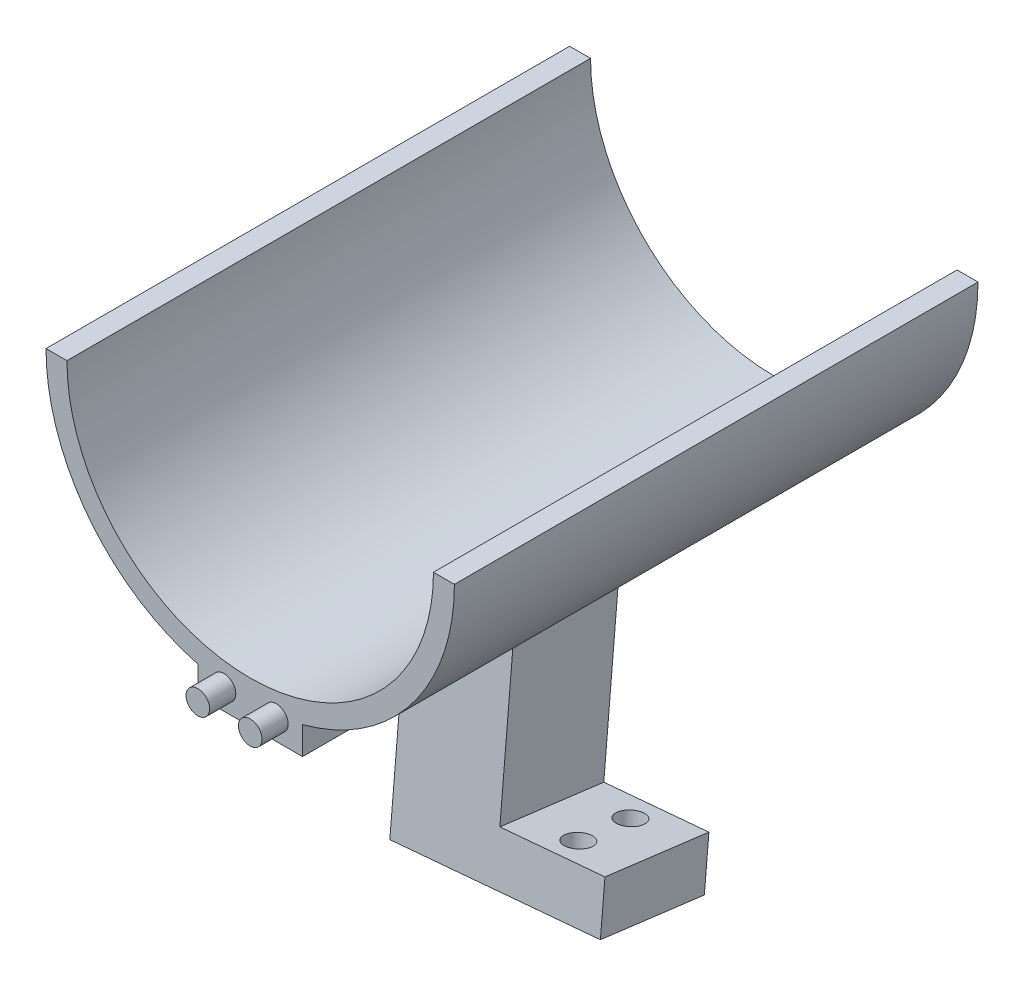
ISO-10303-21;
HEADER;
FILE_DESCRIPTION(('STEP AP214'),'2;1');
FILE_NAME('part.step','',(''),(''),'','','');
FILE_SCHEMA(('AUTOMOTIVE_DESIGN { 1 0 10303 214 1 1 1 1 }'));
ENDSEC;
DATA;
#1=APPLICATION_CONTEXT('core data for automotive mechanical design processes');
#2=APPLICATION_PROTOCOL_DEFINITION('international standard','automotive_design',2000,#1);
#3=PRODUCT_CONTEXT('',#1,'mechanical');
#4=PRODUCT('Part','Part','',(#3));
#5=PRODUCT_RELATED_PRODUCT_CATEGORY('part','',(#4));
#6=PRODUCT_DEFINITION_FORMATION('','',#4);
#7=PRODUCT_DEFINITION_CONTEXT('part definition',#1,'design');
#8=PRODUCT_DEFINITION('design','',#6,#7);
#9=PRODUCT_DEFINITION_SHAPE('','',#8);
#10=(LENGTH_UNIT() NAMED_UNIT(*) SI_UNIT(.MILLI.,.METRE.));
#11=(NAMED_UNIT(*) PLANE_ANGLE_UNIT() SI_UNIT($,.RADIAN.));
#12=(NAMED_UNIT(*) SI_UNIT($,.STERADIAN.) SOLID_ANGLE_UNIT());
#13=UNCERTAINTY_MEASURE_WITH_UNIT(LENGTH_MEASURE(1.E-05),#10,'distance_accuracy_value','');
#14=(GEOMETRIC_REPRESENTATION_CONTEXT(3) GLOBAL_UNCERTAINTY_ASSIGNED_CONTEXT((#13)) GLOBAL_UNIT_ASSIGNED_CONTEXT((#10,
#11,#12)) REPRESENTATION_CONTEXT('',''));
#15=CARTESIAN_POINT('',(0.,0.,0.));
#16=DIRECTION('',(0.,0.,1.));
#17=DIRECTION('',(1.,0.,0.));
#18=AXIS2_PLACEMENT_3D('',#15,#16,#17);
#19=CARTESIAN_POINT('',(9.99999999999999,3.11086419730137,35.544910429642));
#20=DIRECTION('',(-1.,0.,0.));
#21=DIRECTION('',(0.,0.,1.));
#22=AXIS2_PLACEMENT_3D('',#19,#20,#21);
#23=PLANE('',#22);
#24=DIRECTION('',(0.,0.126169711722162,0.992008671254413));
#25=VECTOR('',#24,1.);
#26=CARTESIAN_POINT('',(9.99999999999999,-75.9900166830293,42.4653407815849));
#27=LINE('',#26,#25);
#28=CARTESIAN_POINT('',(9.99999999999999,-75.9900166830294,42.4653407815849));
#29=VERTEX_POINT('',#28);
#30=CARTESIAN_POINT('',(10.,-73.4646784272924,62.3207990635066));
#31=VERTEX_POINT('',#30);
#32=EDGE_CURVE('E59',#29,#31,#27,.T.);
#33=ORIENTED_EDGE('',*,*,#32,.F.);
#34=DIRECTION('',(0.,-0.996194698091746,0.0871557427476515));
#35=VECTOR('',#34,1.);
#36=CARTESIAN_POINT('',(9.99999999999999,3.11086419730137,35.544910429642));
#37=LINE('',#36,#35);
#38=CARTESIAN_POINT('',(9.99999999999999,-37.6961536499415,39.1150618835755));
#39=VERTEX_POINT('',#38);
#40=EDGE_CURVE('E214',#39,#29,#37,.T.);
#41=ORIENTED_EDGE('',*,*,#40,.F.);
#42=DIRECTION('',(0.,0.,-1.));
#43=VECTOR('',#42,1.);
#44=CARTESIAN_POINT('',(10.,-37.6961536499415,100.));
#45=LINE('',#44,#43);
#46=CARTESIAN_POINT('',(10.,-37.6961536499415,59.1914586344425));
#47=VERTEX_POINT('',#46);
#48=EDGE_CURVE('E216',#47,#39,#45,.T.);
#49=ORIENTED_EDGE('',*,*,#48,.F.);
#50=DIRECTION('',(0.,-0.996194698091746,0.0871557427476515));
#51=VECTOR('',#50,1.);
#52=CARTESIAN_POINT('',(10.,4.8539790522544,55.4688043914769));
#53=LINE('',#52,#51);
#54=EDGE_CURVE('E64',#47,#31,#53,.T.);
#55=ORIENTED_EDGE('',*,*,#54,.T.);
#56=EDGE_LOOP('',(#33,#41,#49,#55));
#57=FACE_BOUND('',#56,.T.);
#58=ADVANCED_FACE('F44',(#57),#23,.F.);
#59=CARTESIAN_POINT('',(0.,0.,100.));
#60=DIRECTION('',(0.,0.,-1.));
#61=DIRECTION('',(-1.,0.,0.));
#62=AXIS2_PLACEMENT_3D('',#59,#60,#61);
#63=CYLINDRICAL_SURFACE('',#62,39.);
#64=DIRECTION('',(0.,0.,-1.));
#65=VECTOR('',#64,1.);
#66=CARTESIAN_POINT('',(10.,-37.6961536499415,100.));
#67=LINE('',#66,#65);
#68=CARTESIAN_POINT('',(10.,-37.6961536499415,0.));
#69=VERTEX_POINT('',#68);
#70=CARTESIAN_POINT('',(10.,-37.6961536499415,9.99999999999999));
#71=VERTEX_POINT('',#70);
#72=EDGE_CURVE('E261',#69,#71,#67,.F.);
#73=ORIENTED_EDGE('',*,*,#72,.F.);
#74=CARTESIAN_POINT('',(0.,0.,0.));
#75=DIRECTION('',(0.,0.,1.));
#76=DIRECTION('',(1.,0.,0.));
#77=AXIS2_PLACEMENT_3D('',#74,#75,#76);
#78=CIRCLE('',#77,39.);
#79=CARTESIAN_POINT('',(39.,0.,0.));
#80=VERTEX_POINT('',#79);
#81=EDGE_CURVE('E306',#69,#80,#78,.T.);
#82=ORIENTED_EDGE('',*,*,#81,.T.);
#83=DIRECTION('',(0.,0.,-1.));
#84=VECTOR('',#83,1.);
#85=CARTESIAN_POINT('',(39.,0.,100.));
#86=LINE('',#85,#84);
#87=CARTESIAN_POINT('',(39.,0.,100.));
#88=VERTEX_POINT('',#87);
#89=EDGE_CURVE('E11',#88,#80,#86,.T.);
#90=ORIENTED_EDGE('',*,*,#89,.F.);
#91=CARTESIAN_POINT('',(0.,0.,100.));
#92=DIRECTION('',(0.,0.,1.));
#93=DIRECTION('',(1.,0.,0.));
#94=AXIS2_PLACEMENT_3D('',#91,#92,#93);
#95=CIRCLE('',#94,39.);
#96=CARTESIAN_POINT('',(10.,-37.6961536499415,100.));
#97=VERTEX_POINT('',#96);
#98=EDGE_CURVE('E311',#97,#88,#95,.T.);
#99=ORIENTED_EDGE('',*,*,#98,.F.);
#100=DIRECTION('',(0.,0.,-1.));
#101=VECTOR('',#100,1.);
#102=CARTESIAN_POINT('',(10.,-37.6961536499415,100.));
#103=LINE('',#102,#101);
#104=CARTESIAN_POINT('',(10.,-37.6961536499415,90.));
#105=VERTEX_POINT('',#104);
#106=EDGE_CURVE('E298',#97,#105,#103,.T.);
#107=ORIENTED_EDGE('',*,*,#106,.T.);
#108=CARTESIAN_POINT('',(0.,0.,90.));
#109=DIRECTION('',(0.,0.,1.));
#110=DIRECTION('',(1.,0.,0.));
#111=AXIS2_PLACEMENT_3D('',#108,#109,#110);
#112=CIRCLE('',#111,39.);
#113=CARTESIAN_POINT('',(-10.,-37.6961536499415,90.));
#114=VERTEX_POINT('',#113);
#115=EDGE_CURVE('E304',#114,#105,#112,.T.);
#116=ORIENTED_EDGE('',*,*,#115,.F.);
#117=DIRECTION('',(0.,0.,-1.));
#118=VECTOR('',#117,1.);
#119=CARTESIAN_POINT('',(-10.,-37.6961536499415,100.));
#120=LINE('',#119,#118);
#121=CARTESIAN_POINT('',(-10.,-37.6961536499415,100.));
#122=VERTEX_POINT('',#121);
#123=EDGE_CURVE('E302',#122,#114,#120,.T.);
#124=ORIENTED_EDGE('',*,*,#123,.F.);
#125=CARTESIAN_POINT('',(-39.,0.,100.));
#126=VERTEX_POINT('',#125);
#127=EDGE_CURVE('E307',#126,#122,#95,.T.);
#128=ORIENTED_EDGE('',*,*,#127,.F.);
#129=DIRECTION('',(0.,0.,-1.));
#130=VECTOR('',#129,1.);
#131=CARTESIAN_POINT('',(-39.,0.,100.));
#132=LINE('',#131,#130);
#133=CARTESIAN_POINT('',(-39.,0.,0.));
#134=VERTEX_POINT('',#133);
#135=EDGE_CURVE('E319',#126,#134,#132,.T.);
#136=ORIENTED_EDGE('',*,*,#135,.T.);
#137=CARTESIAN_POINT('',(-10.,-37.6961536499415,0.));
#138=VERTEX_POINT('',#137);
#139=EDGE_CURVE('E320',#134,#138,#78,.T.);
#140=ORIENTED_EDGE('',*,*,#139,.T.);
#141=DIRECTION('',(0.,0.,-1.));
#142=VECTOR('',#141,1.);
#143=CARTESIAN_POINT('',(-10.,-37.6961536499415,100.));
#144=LINE('',#143,#142);
#145=CARTESIAN_POINT('',(-10.,-37.6961536499415,9.99999999999999));
#146=VERTEX_POINT('',#145);
#147=EDGE_CURVE('E258',#138,#146,#144,.F.);
#148=ORIENTED_EDGE('',*,*,#147,.T.);
#149=CARTESIAN_POINT('',(0.,0.,9.99999999999999));
#150=DIRECTION('',(0.,0.,-1.));
#151=DIRECTION('',(-1.,0.,0.));
#152=AXIS2_PLACEMENT_3D('',#149,#150,#151);
#153=CIRCLE('',#152,39.);
#154=EDGE_CURVE('E264',#71,#146,#153,.T.);
#155=ORIENTED_EDGE('',*,*,#154,.F.);
#156=EDGE_LOOP('',(#73,#82,#90,#99,#107,#116,#124,#128,#136,#140,#148,#155));
#157=FACE_BOUND('',#156,.T.);
#158=ORIENTED_EDGE('',*,*,#48,.T.);
#159=CARTESIAN_POINT('',(0.,0.,35.8170757806745));
#160=DIRECTION('',(0.,0.0871557427476515,0.996194698091746));
#161=DIRECTION('',(0.,0.996194698091746,-0.0871557427476515));
#162=AXIS2_PLACEMENT_3D('',#159,#160,#161);
#163=ELLIPSE('',#162,39.1489736641905,39.);
#164=CARTESIAN_POINT('',(-9.99999999999999,-37.6961536499415,39.1150618835756));
#165=VERTEX_POINT('',#164);
#166=EDGE_CURVE('E213',#39,#165,#163,.F.);
#167=ORIENTED_EDGE('',*,*,#166,.T.);
#168=DIRECTION('',(0.,0.,-1.));
#169=VECTOR('',#168,1.);
#170=CARTESIAN_POINT('',(-9.99999999999999,-37.6961536499415,100.));
#171=LINE('',#170,#169);
#172=CARTESIAN_POINT('',(-10.,-37.6961536499415,59.1914586344425));
#173=VERTEX_POINT('',#172);
#174=EDGE_CURVE('E211',#165,#173,#171,.F.);
#175=ORIENTED_EDGE('',*,*,#174,.T.);
#176=CARTESIAN_POINT('',(0.,0.,55.8934725315415));
#177=DIRECTION('',(0.,-0.0871557427476515,-0.996194698091746));
#178=DIRECTION('',(0.,0.996194698091746,-0.0871557427476515));
#179=AXIS2_PLACEMENT_3D('',#176,#177,#178);
#180=ELLIPSE('',#179,39.1489736641905,39.);
#181=EDGE_CURVE('E218',#173,#47,#180,.F.);
#182=ORIENTED_EDGE('',*,*,#181,.T.);
#183=EDGE_LOOP('',(#158,#167,#175,#182));
#184=FACE_BOUND('',#183,.T.);
#185=ADVANCED_FACE('F46',(#157,#184),#63,.T.);
#186=CARTESIAN_POINT('',(35.,0.,100.));
#187=DIRECTION('',(0.,1.,0.));
#188=DIRECTION('',(0.,0.,1.));
#189=AXIS2_PLACEMENT_3D('',#186,#187,#188);
#190=PLANE('',#189);
#191=DIRECTION('',(1.,0.,0.));
#192=VECTOR('',#191,1.);
#193=CARTESIAN_POINT('',(35.,0.,0.));
#194=LINE('',#193,#192);
#195=CARTESIAN_POINT('',(35.,0.,0.));
#196=VERTEX_POINT('',#195);
#197=EDGE_CURVE('E322',#196,#80,#194,.T.);
#198=ORIENTED_EDGE('',*,*,#197,.F.);
#199=DIRECTION('',(0.,0.,-1.));
#200=VECTOR('',#199,1.);
#201=CARTESIAN_POINT('',(35.,0.,100.));
#202=LINE('',#201,#200);
#203=CARTESIAN_POINT('',(35.,0.,100.));
#204=VERTEX_POINT('',#203);
#205=EDGE_CURVE('E52',#204,#196,#202,.T.);
#206=ORIENTED_EDGE('',*,*,#205,.F.);
#207=DIRECTION('',(1.,0.,0.));
#208=VECTOR('',#207,1.);
#209=CARTESIAN_POINT('',(35.,0.,100.));
#210=LINE('',#209,#208);
#211=EDGE_CURVE('E310',#204,#88,#210,.T.);
#212=ORIENTED_EDGE('',*,*,#211,.T.);
#213=ORIENTED_EDGE('',*,*,#89,.T.);
#214=EDGE_LOOP('',(#198,#206,#212,#213));
#215=FACE_BOUND('',#214,.T.);
#216=ADVANCED_FACE('F341',(#215),#190,.T.);
#217=CARTESIAN_POINT('',(0.,0.,100.));
#218=DIRECTION('',(0.,0.,-1.));
#219=DIRECTION('',(-1.,0.,0.));
#220=AXIS2_PLACEMENT_3D('',#217,#218,#219);
#221=CYLINDRICAL_SURFACE('',#220,35.);
#222=ORIENTED_EDGE('',*,*,#205,.T.);
#223=CARTESIAN_POINT('',(0.,0.,0.));
#224=DIRECTION('',(0.,0.,1.));
#225=DIRECTION('',(1.,0.,0.));
#226=AXIS2_PLACEMENT_3D('',#223,#224,#225);
#227=CIRCLE('',#226,35.);
#228=CARTESIAN_POINT('',(-35.,0.,0.));
#229=VERTEX_POINT('',#228);
#230=EDGE_CURVE('E325',#229,#196,#227,.T.);
#231=ORIENTED_EDGE('',*,*,#230,.F.);
#232=DIRECTION('',(0.,0.,-1.));
#233=VECTOR('',#232,1.);
#234=CARTESIAN_POINT('',(-35.,0.,100.));
#235=LINE('',#234,#233);
#236=CARTESIAN_POINT('',(-35.,0.,100.));
#237=VERTEX_POINT('',#236);
#238=EDGE_CURVE('E331',#237,#229,#235,.T.);
#239=ORIENTED_EDGE('',*,*,#238,.F.);
#240=CARTESIAN_POINT('',(0.,0.,100.));
#241=DIRECTION('',(0.,0.,1.));
#242=DIRECTION('',(1.,0.,0.));
#243=AXIS2_PLACEMENT_3D('',#240,#241,#242);
#244=CIRCLE('',#243,35.);
#245=EDGE_CURVE('E314',#237,#204,#244,.T.);
#246=ORIENTED_EDGE('',*,*,#245,.T.);
#247=EDGE_LOOP('',(#222,#231,#239,#246));
#248=FACE_BOUND('',#247,.T.);
#249=ADVANCED_FACE('F337',(#248),#221,.F.);
#250=CARTESIAN_POINT('',(-39.,0.,100.));
#251=DIRECTION('',(0.,1.,0.));
#252=DIRECTION('',(-1.,0.,0.));
#253=AXIS2_PLACEMENT_3D('',#250,#251,#252);
#254=PLANE('',#253);
#255=DIRECTION('',(1.,0.,0.));
#256=VECTOR('',#255,1.);
#257=CARTESIAN_POINT('',(-39.,0.,0.));
#258=LINE('',#257,#256);
#259=EDGE_CURVE('E327',#134,#229,#258,.T.);
#260=ORIENTED_EDGE('',*,*,#259,.F.);
#261=ORIENTED_EDGE('',*,*,#135,.F.);
#262=DIRECTION('',(1.,0.,0.));
#263=VECTOR('',#262,1.);
#264=CARTESIAN_POINT('',(-39.,0.,100.));
#265=LINE('',#264,#263);
#266=EDGE_CURVE('E316',#126,#237,#265,.T.);
#267=ORIENTED_EDGE('',*,*,#266,.T.);
#268=ORIENTED_EDGE('',*,*,#238,.T.);
#269=EDGE_LOOP('',(#260,#261,#267,#268));
#270=FACE_BOUND('',#269,.T.);
#271=ADVANCED_FACE('F350',(#270),#254,.T.);
#272=CARTESIAN_POINT('',(0.,0.,100.));
#273=DIRECTION('',(0.,0.,1.));
#274=DIRECTION('',(1.,0.,0.));
#275=AXIS2_PLACEMENT_3D('',#272,#273,#274);
#276=PLANE('',#275);
#277=CARTESIAN_POINT('',(5.,-39.,100.));
#278=DIRECTION('',(0.,0.,1.));
#279=DIRECTION('',(1.,0.,0.));
#280=AXIS2_PLACEMENT_3D('',#277,#278,#279);
#281=CIRCLE('',#280,2.25);
#282=CARTESIAN_POINT('',(7.25,-39.,100.));
#283=VERTEX_POINT('',#282);
#284=EDGE_CURVE('E267',#283,#283,#281,.T.);
#285=ORIENTED_EDGE('',*,*,#284,.F.);
#286=EDGE_LOOP('',(#285));
#287=FACE_BOUND('',#286,.T.);
#288=CARTESIAN_POINT('',(-5.,-39.,100.));
#289=DIRECTION('',(0.,0.,1.));
#290=DIRECTION('',(1.,0.,0.));
#291=AXIS2_PLACEMENT_3D('',#288,#289,#290);
#292=CIRCLE('',#291,2.25);
#293=CARTESIAN_POINT('',(-2.75,-39.,100.));
#294=VERTEX_POINT('',#293);
#295=EDGE_CURVE('E271',#294,#294,#292,.T.);
#296=ORIENTED_EDGE('',*,*,#295,.F.);
#297=EDGE_LOOP('',(#296));
#298=FACE_BOUND('',#297,.T.);
#299=ORIENTED_EDGE('',*,*,#127,.T.);
#300=DIRECTION('',(0.,1.,0.));
#301=VECTOR('',#300,1.);
#302=CARTESIAN_POINT('',(-10.,0.,100.));
#303=LINE('',#302,#301);
#304=CARTESIAN_POINT('',(-10.,-43.,100.));
#305=VERTEX_POINT('',#304);
#306=EDGE_CURVE('E284',#305,#122,#303,.T.);
#307=ORIENTED_EDGE('',*,*,#306,.F.);
#308=DIRECTION('',(1.,0.,0.));
#309=VECTOR('',#308,1.);
#310=CARTESIAN_POINT('',(0.,-43.,100.));
#311=LINE('',#310,#309);
#312=CARTESIAN_POINT('',(10.,-43.,100.));
#313=VERTEX_POINT('',#312);
#314=EDGE_CURVE('E277',#305,#313,#311,.T.);
#315=ORIENTED_EDGE('',*,*,#314,.T.);
#316=DIRECTION('',(0.,1.,0.));
#317=VECTOR('',#316,1.);
#318=CARTESIAN_POINT('',(10.,0.,100.));
#319=LINE('',#318,#317);
#320=EDGE_CURVE('E293',#313,#97,#319,.T.);
#321=ORIENTED_EDGE('',*,*,#320,.T.);
#322=ORIENTED_EDGE('',*,*,#98,.T.);
#323=ORIENTED_EDGE('',*,*,#211,.F.);
#324=ORIENTED_EDGE('',*,*,#245,.F.);
#325=ORIENTED_EDGE('',*,*,#266,.F.);
#326=EDGE_LOOP('',(#299,#307,#315,#321,#322,#323,#324,#325));
#327=FACE_BOUND('',#326,.T.);
#328=ADVANCED_FACE('F354',(#287,#298,#327),#276,.T.);
#329=CARTESIAN_POINT('',(0.,0.,0.));
#330=DIRECTION('',(0.,0.,1.));
#331=DIRECTION('',(1.,0.,0.));
#332=AXIS2_PLACEMENT_3D('',#329,#330,#331);
#333=PLANE('',#332);
#334=CARTESIAN_POINT('',(5.,-39.,0.));
#335=DIRECTION('',(0.,0.,-1.));
#336=DIRECTION('',(-1.,0.,0.));
#337=AXIS2_PLACEMENT_3D('',#334,#335,#336);
#338=CIRCLE('',#337,2.25);
#339=CARTESIAN_POINT('',(2.75,-39.,0.));
#340=VERTEX_POINT('',#339);
#341=EDGE_CURVE('E230',#340,#340,#338,.T.);
#342=ORIENTED_EDGE('',*,*,#341,.F.);
#343=EDGE_LOOP('',(#342));
#344=FACE_BOUND('',#343,.T.);
#345=CARTESIAN_POINT('',(-5.,-39.,0.));
#346=DIRECTION('',(0.,0.,-1.));
#347=DIRECTION('',(-1.,0.,0.));
#348=AXIS2_PLACEMENT_3D('',#345,#346,#347);
#349=CIRCLE('',#348,2.25);
#350=CARTESIAN_POINT('',(-7.25,-39.,0.));
#351=VERTEX_POINT('',#350);
#352=EDGE_CURVE('E225',#351,#351,#349,.T.);
#353=ORIENTED_EDGE('',*,*,#352,.F.);
#354=EDGE_LOOP('',(#353));
#355=FACE_BOUND('',#354,.T.);
#356=ORIENTED_EDGE('',*,*,#81,.F.);
#357=DIRECTION('',(0.,1.,0.));
#358=VECTOR('',#357,1.);
#359=CARTESIAN_POINT('',(10.,0.,0.));
#360=LINE('',#359,#358);
#361=CARTESIAN_POINT('',(10.,-43.,0.));
#362=VERTEX_POINT('',#361);
#363=EDGE_CURVE('E242',#362,#69,#360,.T.);
#364=ORIENTED_EDGE('',*,*,#363,.F.);
#365=DIRECTION('',(-1.,0.,0.));
#366=VECTOR('',#365,1.);
#367=CARTESIAN_POINT('',(0.,-43.,0.));
#368=LINE('',#367,#366);
#369=CARTESIAN_POINT('',(-10.,-43.,0.));
#370=VERTEX_POINT('',#369);
#371=EDGE_CURVE('E229',#362,#370,#368,.T.);
#372=ORIENTED_EDGE('',*,*,#371,.T.);
#373=DIRECTION('',(0.,1.,0.));
#374=VECTOR('',#373,1.);
#375=CARTESIAN_POINT('',(-10.,0.,0.));
#376=LINE('',#375,#374);
#377=EDGE_CURVE('E251',#370,#138,#376,.T.);
#378=ORIENTED_EDGE('',*,*,#377,.T.);
#379=ORIENTED_EDGE('',*,*,#139,.F.);
#380=ORIENTED_EDGE('',*,*,#259,.T.);
#381=ORIENTED_EDGE('',*,*,#230,.T.);
#382=ORIENTED_EDGE('',*,*,#197,.T.);
#383=EDGE_LOOP('',(#356,#364,#372,#378,#379,#380,#381,#382));
#384=FACE_BOUND('',#383,.T.);
#385=ADVANCED_FACE('F344',(#344,#355,#384),#333,.F.);
#386=CARTESIAN_POINT('',(-10.,0.,90.));
#387=DIRECTION('',(1.,0.,0.));
#388=DIRECTION('',(0.,0.,-1.));
#389=AXIS2_PLACEMENT_3D('',#386,#387,#388);
#390=PLANE('',#389);
#391=ORIENTED_EDGE('',*,*,#306,.T.);
#392=ORIENTED_EDGE('',*,*,#123,.T.);
#393=DIRECTION('',(0.,1.,0.));
#394=VECTOR('',#393,1.);
#395=CARTESIAN_POINT('',(-10.,0.,90.));
#396=LINE('',#395,#394);
#397=CARTESIAN_POINT('',(-10.,-43.,90.));
#398=VERTEX_POINT('',#397);
#399=EDGE_CURVE('E287',#398,#114,#396,.T.);
#400=ORIENTED_EDGE('',*,*,#399,.F.);
#401=DIRECTION('',(0.,0.,1.));
#402=VECTOR('',#401,1.);
#403=CARTESIAN_POINT('',(-10.,-43.,90.));
#404=LINE('',#403,#402);
#405=EDGE_CURVE('E296',#398,#305,#404,.T.);
#406=ORIENTED_EDGE('',*,*,#405,.T.);
#407=EDGE_LOOP('',(#391,#392,#400,#406));
#408=FACE_BOUND('',#407,.T.);
#409=ADVANCED_FACE('F412',(#408),#390,.F.);
#410=CARTESIAN_POINT('',(10.,0.,90.));
#411=DIRECTION('',(1.,0.,0.));
#412=DIRECTION('',(0.,0.,-1.));
#413=AXIS2_PLACEMENT_3D('',#410,#411,#412);
#414=PLANE('',#413);
#415=ORIENTED_EDGE('',*,*,#106,.F.);
#416=ORIENTED_EDGE('',*,*,#320,.F.);
#417=DIRECTION('',(0.,0.,1.));
#418=VECTOR('',#417,1.);
#419=CARTESIAN_POINT('',(10.,-43.,90.));
#420=LINE('',#419,#418);
#421=CARTESIAN_POINT('',(10.,-43.,90.));
#422=VERTEX_POINT('',#421);
#423=EDGE_CURVE('E290',#422,#313,#420,.T.);
#424=ORIENTED_EDGE('',*,*,#423,.F.);
#425=DIRECTION('',(0.,1.,0.));
#426=VECTOR('',#425,1.);
#427=CARTESIAN_POINT('',(10.,0.,90.));
#428=LINE('',#427,#426);
#429=EDGE_CURVE('E283',#422,#105,#428,.T.);
#430=ORIENTED_EDGE('',*,*,#429,.T.);
#431=EDGE_LOOP('',(#415,#416,#424,#430));
#432=FACE_BOUND('',#431,.T.);
#433=ADVANCED_FACE('F419',(#432),#414,.T.);
#434=CARTESIAN_POINT('',(0.,-43.,90.));
#435=DIRECTION('',(0.,-1.,0.));
#436=DIRECTION('',(0.,0.,-1.));
#437=AXIS2_PLACEMENT_3D('',#434,#435,#436);
#438=PLANE('',#437);
#439=ORIENTED_EDGE('',*,*,#314,.F.);
#440=ORIENTED_EDGE('',*,*,#405,.F.);
#441=DIRECTION('',(1.,0.,0.));
#442=VECTOR('',#441,1.);
#443=CARTESIAN_POINT('',(0.,-43.,90.));
#444=LINE('',#443,#442);
#445=EDGE_CURVE('E280',#398,#422,#444,.T.);
#446=ORIENTED_EDGE('',*,*,#445,.T.);
#447=ORIENTED_EDGE('',*,*,#423,.T.);
#448=EDGE_LOOP('',(#439,#440,#446,#447));
#449=FACE_BOUND('',#448,.T.);
#450=ADVANCED_FACE('F728',(#449),#438,.T.);
#451=CARTESIAN_POINT('',(0.,0.,90.));
#452=DIRECTION('',(0.,0.,1.));
#453=DIRECTION('',(1.,0.,0.));
#454=AXIS2_PLACEMENT_3D('',#451,#452,#453);
#455=PLANE('',#454);
#456=ORIENTED_EDGE('',*,*,#399,.T.);
#457=ORIENTED_EDGE('',*,*,#115,.T.);
#458=ORIENTED_EDGE('',*,*,#429,.F.);
#459=ORIENTED_EDGE('',*,*,#445,.F.);
#460=EDGE_LOOP('',(#456,#457,#458,#459));
#461=FACE_BOUND('',#460,.T.);
#462=ADVANCED_FACE('F458',(#461),#455,.F.);
#463=CARTESIAN_POINT('',(-5.,-39.,105.));
#464=DIRECTION('',(0.,0.,-1.));
#465=DIRECTION('',(-1.,0.,0.));
#466=AXIS2_PLACEMENT_3D('',#463,#464,#465);
#467=CYLINDRICAL_SURFACE('',#466,2.25);
#468=CARTESIAN_POINT('',(-5.,-39.,105.));
#469=DIRECTION('',(0.,0.,1.));
#470=DIRECTION('',(1.,0.,0.));
#471=AXIS2_PLACEMENT_3D('',#468,#469,#470);
#472=CIRCLE('',#471,2.25);
#473=CARTESIAN_POINT('',(-2.75,-39.,105.));
#474=VERTEX_POINT('',#473);
#475=EDGE_CURVE('E274',#474,#474,#472,.T.);
#476=ORIENTED_EDGE('',*,*,#475,.F.);
#477=EDGE_LOOP('',(#476));
#478=FACE_BOUND('',#477,.T.);
#479=ORIENTED_EDGE('',*,*,#295,.T.);
#480=EDGE_LOOP('',(#479));
#481=FACE_BOUND('',#480,.T.);
#482=ADVANCED_FACE('F463',(#478,#481),#467,.T.);
#483=CARTESIAN_POINT('',(0.,0.,105.));
#484=DIRECTION('',(0.,0.,1.));
#485=DIRECTION('',(1.,0.,0.));
#486=AXIS2_PLACEMENT_3D('',#483,#484,#485);
#487=PLANE('',#486);
#488=ORIENTED_EDGE('',*,*,#475,.T.);
#489=EDGE_LOOP('',(#488));
#490=FACE_BOUND('',#489,.T.);
#491=ADVANCED_FACE('F468',(#490),#487,.T.);
#492=CARTESIAN_POINT('',(5.,-39.,105.));
#493=DIRECTION('',(0.,0.,-1.));
#494=DIRECTION('',(-1.,0.,0.));
#495=AXIS2_PLACEMENT_3D('',#492,#493,#494);
#496=CYLINDRICAL_SURFACE('',#495,2.25);
#497=CARTESIAN_POINT('',(5.,-39.,105.));
#498=DIRECTION('',(0.,0.,1.));
#499=DIRECTION('',(1.,0.,0.));
#500=AXIS2_PLACEMENT_3D('',#497,#498,#499);
#501=CIRCLE('',#500,2.25);
#502=CARTESIAN_POINT('',(7.25,-39.,105.));
#503=VERTEX_POINT('',#502);
#504=EDGE_CURVE('E268',#503,#503,#501,.T.);
#505=ORIENTED_EDGE('',*,*,#504,.F.);
#506=EDGE_LOOP('',(#505));
#507=FACE_BOUND('',#506,.T.);
#508=ORIENTED_EDGE('',*,*,#284,.T.);
#509=EDGE_LOOP('',(#508));
#510=FACE_BOUND('',#509,.T.);
#511=ADVANCED_FACE('F479',(#507,#510),#496,.T.);
#512=CARTESIAN_POINT('',(0.,0.,105.));
#513=DIRECTION('',(0.,0.,1.));
#514=DIRECTION('',(1.,0.,0.));
#515=AXIS2_PLACEMENT_3D('',#512,#513,#514);
#516=PLANE('',#515);
#517=ORIENTED_EDGE('',*,*,#504,.T.);
#518=EDGE_LOOP('',(#517));
#519=FACE_BOUND('',#518,.T.);
#520=ADVANCED_FACE('F489',(#519),#516,.T.);
#521=CARTESIAN_POINT('',(10.,0.,10.));
#522=DIRECTION('',(-1.,0.,0.));
#523=DIRECTION('',(0.,0.,1.));
#524=AXIS2_PLACEMENT_3D('',#521,#522,#523);
#525=PLANE('',#524);
#526=ORIENTED_EDGE('',*,*,#363,.T.);
#527=ORIENTED_EDGE('',*,*,#72,.T.);
#528=DIRECTION('',(0.,1.,0.));
#529=VECTOR('',#528,1.);
#530=CARTESIAN_POINT('',(10.,0.,10.));
#531=LINE('',#530,#529);
#532=CARTESIAN_POINT('',(10.,-43.,10.));
#533=VERTEX_POINT('',#532);
#534=EDGE_CURVE('E245',#533,#71,#531,.T.);
#535=ORIENTED_EDGE('',*,*,#534,.F.);
#536=DIRECTION('',(0.,0.,-1.));
#537=VECTOR('',#536,1.);
#538=CARTESIAN_POINT('',(10.,-43.,10.));
#539=LINE('',#538,#537);
#540=EDGE_CURVE('E256',#533,#362,#539,.T.);
#541=ORIENTED_EDGE('',*,*,#540,.T.);
#542=EDGE_LOOP('',(#526,#527,#535,#541));
#543=FACE_BOUND('',#542,.T.);
#544=ADVANCED_FACE('F362',(#543),#525,.F.);
#545=CARTESIAN_POINT('',(-10.,0.,10.));
#546=DIRECTION('',(-1.,0.,0.));
#547=DIRECTION('',(0.,0.,1.));
#548=AXIS2_PLACEMENT_3D('',#545,#546,#547);
#549=PLANE('',#548);
#550=ORIENTED_EDGE('',*,*,#147,.F.);
#551=ORIENTED_EDGE('',*,*,#377,.F.);
#552=DIRECTION('',(0.,0.,-1.));
#553=VECTOR('',#552,1.);
#554=CARTESIAN_POINT('',(-10.,-43.,10.));
#555=LINE('',#554,#553);
#556=CARTESIAN_POINT('',(-10.,-43.,10.));
#557=VERTEX_POINT('',#556);
#558=EDGE_CURVE('E248',#557,#370,#555,.T.);
#559=ORIENTED_EDGE('',*,*,#558,.F.);
#560=DIRECTION('',(0.,1.,0.));
#561=VECTOR('',#560,1.);
#562=CARTESIAN_POINT('',(-10.,0.,10.));
#563=LINE('',#562,#561);
#564=EDGE_CURVE('E241',#557,#146,#563,.T.);
#565=ORIENTED_EDGE('',*,*,#564,.T.);
#566=EDGE_LOOP('',(#550,#551,#559,#565));
#567=FACE_BOUND('',#566,.T.);
#568=ADVANCED_FACE('F371',(#567),#549,.T.);
#569=CARTESIAN_POINT('',(0.,-43.,10.));
#570=DIRECTION('',(0.,-1.,0.));
#571=DIRECTION('',(0.,0.,-1.));
#572=AXIS2_PLACEMENT_3D('',#569,#570,#571);
#573=PLANE('',#572);
#574=ORIENTED_EDGE('',*,*,#371,.F.);
#575=ORIENTED_EDGE('',*,*,#540,.F.);
#576=DIRECTION('',(-1.,0.,0.));
#577=VECTOR('',#576,1.);
#578=CARTESIAN_POINT('',(0.,-43.,10.));
#579=LINE('',#578,#577);
#580=EDGE_CURVE('E238',#533,#557,#579,.T.);
#581=ORIENTED_EDGE('',*,*,#580,.T.);
#582=ORIENTED_EDGE('',*,*,#558,.T.);
#583=EDGE_LOOP('',(#574,#575,#581,#582));
#584=FACE_BOUND('',#583,.T.);
#585=ADVANCED_FACE('F365',(#584),#573,.T.);
#586=CARTESIAN_POINT('',(0.,0.,10.));
#587=DIRECTION('',(0.,0.,-1.));
#588=DIRECTION('',(-1.,0.,0.));
#589=AXIS2_PLACEMENT_3D('',#586,#587,#588);
#590=PLANE('',#589);
#591=ORIENTED_EDGE('',*,*,#534,.T.);
#592=ORIENTED_EDGE('',*,*,#154,.T.);
#593=ORIENTED_EDGE('',*,*,#564,.F.);
#594=ORIENTED_EDGE('',*,*,#580,.F.);
#595=EDGE_LOOP('',(#591,#592,#593,#594));
#596=FACE_BOUND('',#595,.T.);
#597=ADVANCED_FACE('F373',(#596),#590,.F.);
#598=CARTESIAN_POINT('',(-5.,-39.,6.));
#599=DIRECTION('',(0.,0.,-1.));
#600=DIRECTION('',(-1.,0.,0.));
#601=AXIS2_PLACEMENT_3D('',#598,#599,#600);
#602=CYLINDRICAL_SURFACE('',#601,2.25);
#603=CARTESIAN_POINT('',(-5.,-39.,6.));
#604=DIRECTION('',(0.,0.,-1.));
#605=DIRECTION('',(-1.,0.,0.));
#606=AXIS2_PLACEMENT_3D('',#603,#604,#605);
#607=CIRCLE('',#606,2.25);
#608=CARTESIAN_POINT('',(-7.25,-39.,6.));
#609=VERTEX_POINT('',#608);
#610=EDGE_CURVE('E233',#609,#609,#607,.T.);
#611=ORIENTED_EDGE('',*,*,#610,.F.);
#612=EDGE_LOOP('',(#611));
#613=FACE_BOUND('',#612,.T.);
#614=ORIENTED_EDGE('',*,*,#352,.T.);
#615=EDGE_LOOP('',(#614));
#616=FACE_BOUND('',#615,.T.);
#617=ADVANCED_FACE('F375',(#613,#616),#602,.F.);
#618=CARTESIAN_POINT('',(0.,0.,6.));
#619=DIRECTION('',(0.,0.,-1.));
#620=DIRECTION('',(-1.,0.,0.));
#621=AXIS2_PLACEMENT_3D('',#618,#619,#620);
#622=PLANE('',#621);
#623=ORIENTED_EDGE('',*,*,#610,.T.);
#624=EDGE_LOOP('',(#623));
#625=FACE_BOUND('',#624,.T.);
#626=ADVANCED_FACE('F381',(#625),#622,.T.);
#627=CARTESIAN_POINT('',(5.,-39.,6.));
#628=DIRECTION('',(0.,0.,-1.));
#629=DIRECTION('',(-1.,0.,0.));
#630=AXIS2_PLACEMENT_3D('',#627,#628,#629);
#631=CYLINDRICAL_SURFACE('',#630,2.25);
#632=CARTESIAN_POINT('',(5.,-39.,6.));
#633=DIRECTION('',(0.,0.,-1.));
#634=DIRECTION('',(-1.,0.,0.));
#635=AXIS2_PLACEMENT_3D('',#632,#633,#634);
#636=CIRCLE('',#635,2.25);
#637=CARTESIAN_POINT('',(2.75,-39.,6.));
#638=VERTEX_POINT('',#637);
#639=EDGE_CURVE('E226',#638,#638,#636,.T.);
#640=ORIENTED_EDGE('',*,*,#639,.F.);
#641=EDGE_LOOP('',(#640));
#642=FACE_BOUND('',#641,.T.);
#643=ORIENTED_EDGE('',*,*,#341,.T.);
#644=EDGE_LOOP('',(#643));
#645=FACE_BOUND('',#644,.T.);
#646=ADVANCED_FACE('F398',(#642,#645),#631,.F.);
#647=CARTESIAN_POINT('',(0.,0.,6.));
#648=DIRECTION('',(0.,0.,-1.));
#649=DIRECTION('',(-1.,0.,0.));
#650=AXIS2_PLACEMENT_3D('',#647,#648,#649);
#651=PLANE('',#650);
#652=ORIENTED_EDGE('',*,*,#639,.T.);
#653=EDGE_LOOP('',(#652));
#654=FACE_BOUND('',#653,.T.);
#655=ADVANCED_FACE('F395',(#654),#651,.T.);
#656=CARTESIAN_POINT('',(-10.,3.11086419730137,35.544910429642));
#657=DIRECTION('',(0.,0.0871557427476515,0.996194698091746));
#658=DIRECTION('',(0.,-0.996194698091746,0.0871557427476515));
#659=AXIS2_PLACEMENT_3D('',#656,#657,#658);
#660=PLANE('',#659);
#661=ORIENTED_EDGE('',*,*,#166,.F.);
#662=ORIENTED_EDGE('',*,*,#40,.T.);
#663=DIRECTION('',(-0.99664710311391,-0.0815088903864268,0.0071311038854171));
#664=VECTOR('',#663,1.);
#665=CARTESIAN_POINT('',(29.9329420622782,-74.3598388753007,42.3227187038766));
#666=LINE('',#665,#664);
#667=CARTESIAN_POINT('',(29.9329420622782,-74.3598388753007,42.3227187038766));
#668=VERTEX_POINT('',#667);
#669=EDGE_CURVE('E206',#668,#29,#666,.T.);
#670=ORIENTED_EDGE('',*,*,#669,.F.);
#671=DIRECTION('',(0.,0.996194698091746,-0.0871557427476508));
#672=VECTOR('',#671,1.);
#673=CARTESIAN_POINT('',(29.9329420622782,-84.3217858562182,43.1942761313531));
#674=LINE('',#673,#672);
#675=CARTESIAN_POINT('',(29.9329420622782,-84.3217858562182,43.1942761313531));
#676=VERTEX_POINT('',#675);
#677=EDGE_CURVE('E190',#676,#668,#674,.T.);
#678=ORIENTED_EDGE('',*,*,#677,.F.);
#679=DIRECTION('',(-0.99664710311391,-0.0815088903864303,0.00713110388538928));
#680=VECTOR('',#679,1.);
#681=CARTESIAN_POINT('',(-12.2122707813266,-87.768552041811,43.4958290984175));
#682=LINE('',#681,#680);
#683=CARTESIAN_POINT('',(-10.,-87.5876256777481,43.480000092629));
#684=VERTEX_POINT('',#683);
#685=EDGE_CURVE('E187',#676,#684,#682,.T.);
#686=ORIENTED_EDGE('',*,*,#685,.T.);
#687=DIRECTION('',(0.,-0.996194698091746,0.0871557427476515));
#688=VECTOR('',#687,1.);
#689=CARTESIAN_POINT('',(-10.,3.11086419730137,35.544910429642));
#690=LINE('',#689,#688);
#691=EDGE_CURVE('E221',#165,#684,#690,.T.);
#692=ORIENTED_EDGE('',*,*,#691,.F.);
#693=EDGE_LOOP('',(#661,#662,#670,#678,#686,#692));
#694=FACE_BOUND('',#693,.T.);
#695=ADVANCED_FACE('F393',(#694),#660,.F.);
#696=CARTESIAN_POINT('',(-10.,3.11086419730137,35.544910429642));
#697=DIRECTION('',(1.,0.,0.));
#698=DIRECTION('',(0.,0.,-1.));
#699=AXIS2_PLACEMENT_3D('',#696,#697,#698);
#700=PLANE('',#699);
#701=ORIENTED_EDGE('',*,*,#174,.F.);
#702=ORIENTED_EDGE('',*,*,#691,.T.);
#703=DIRECTION('',(0.,0.126169711722161,0.992008671254413));
#704=VECTOR('',#703,1.);
#705=CARTESIAN_POINT('',(-10.,-87.7219063050657,42.42421939168));
#706=LINE('',#705,#704);
#707=CARTESIAN_POINT('',(-10.,-85.0622874220113,63.3354583745507));
#708=VERTEX_POINT('',#707);
#709=EDGE_CURVE('E181',#684,#708,#706,.T.);
#710=ORIENTED_EDGE('',*,*,#709,.T.);
#711=DIRECTION('',(0.,-0.996194698091746,0.0871557427476515));
#712=VECTOR('',#711,1.);
#713=CARTESIAN_POINT('',(-10.,4.8539790522544,55.4688043914769));
#714=LINE('',#713,#712);
#715=EDGE_CURVE('E177',#173,#708,#714,.T.);
#716=ORIENTED_EDGE('',*,*,#715,.F.);
#717=EDGE_LOOP('',(#701,#702,#710,#716));
#718=FACE_BOUND('',#717,.T.);
#719=ADVANCED_FACE('F567',(#718),#700,.F.);
#720=CARTESIAN_POINT('',(-10.,4.8539790522544,55.4688043914769));
#721=DIRECTION('',(0.,-0.0871557427476515,-0.996194698091746));
#722=DIRECTION('',(0.,0.996194698091746,-0.0871557427476515));
#723=AXIS2_PLACEMENT_3D('',#720,#721,#722);
#724=PLANE('',#723);
#725=ORIENTED_EDGE('',*,*,#181,.F.);
#726=ORIENTED_EDGE('',*,*,#715,.T.);
#727=DIRECTION('',(0.99664710311391,0.0815088903864303,-0.00713110388538928));
#728=VECTOR('',#727,1.);
#729=CARTESIAN_POINT('',(-12.2763015538735,-85.2484504211926,63.351745526547));
#730=LINE('',#729,#728);
#731=CARTESIAN_POINT('',(29.9329420622782,-81.7964476004813,63.0497344132747));
#732=VERTEX_POINT('',#731);
#733=EDGE_CURVE('E169',#708,#732,#730,.T.);
#734=ORIENTED_EDGE('',*,*,#733,.T.);
#735=DIRECTION('',(0.,-0.996194698091746,0.0871557427476508));
#736=VECTOR('',#735,1.);
#737=CARTESIAN_POINT('',(29.9329420622782,-71.8345006195639,62.1781769857982));
#738=LINE('',#737,#736);
#739=CARTESIAN_POINT('',(29.9329420622782,-71.8345006195639,62.1781769857982));
#740=VERTEX_POINT('',#739);
#741=EDGE_CURVE('E175',#740,#732,#738,.T.);
#742=ORIENTED_EDGE('',*,*,#741,.F.);
#743=DIRECTION('',(-0.99664710311391,-0.0815088903864268,0.0071311038854171));
#744=VECTOR('',#743,1.);
#745=CARTESIAN_POINT('',(29.9329420622782,-71.8345006195639,62.1781769857982));
#746=LINE('',#745,#744);
#747=EDGE_CURVE('E203',#740,#31,#746,.T.);
#748=ORIENTED_EDGE('',*,*,#747,.T.);
#749=ORIENTED_EDGE('',*,*,#54,.F.);
#750=EDGE_LOOP('',(#725,#726,#734,#742,#748,#749));
#751=FACE_BOUND('',#750,.T.);
#752=ADVANCED_FACE('F172',(#751),#724,.F.);
#753=CARTESIAN_POINT('',(154.292451379369,-64.3211373509983,119.593911898825));
#754=DIRECTION('',(0.0817576765469097,-0.988687661731498,0.125747325480715));
#755=DIRECTION('',(0.0432208602319042,-0.122533844351347,-0.991522775446583));
#756=AXIS2_PLACEMENT_3D('',#753,#754,#755);
#757=PLANE('',#756);
#758=CARTESIAN_POINT('',(20.780632132035,-83.1266377323464,58.5417182464818));
#759=DIRECTION('',(0.0817576765469097,-0.988687661731498,0.125747325480715));
#760=DIRECTION('',(0.,-0.126169711722161,-0.992008671254413));
#761=AXIS2_PLACEMENT_3D('',#758,#759,#760);
#762=CIRCLE('',#761,2.5);
#763=CARTESIAN_POINT('',(20.780632132035,-83.4420620116518,56.0616965683457));
#764=VERTEX_POINT('',#763);
#765=EDGE_CURVE('E197',#764,#764,#762,.T.);
#766=ORIENTED_EDGE('',*,*,#765,.F.);
#767=EDGE_LOOP('',(#766));
#768=FACE_BOUND('',#767,.T.);
#769=CARTESIAN_POINT('',(20.780632132035,-84.3902723711477,48.6063977810697));
#770=DIRECTION('',(0.0817576765469097,-0.988687661731498,0.125747325480715));
#771=DIRECTION('',(0.,-0.126169711722161,-0.992008671254413));
#772=AXIS2_PLACEMENT_3D('',#769,#770,#771);
#773=CIRCLE('',#772,2.5);
#774=CARTESIAN_POINT('',(20.780632132035,-84.7056966504531,46.1263761029336));
#775=VERTEX_POINT('',#774);
#776=EDGE_CURVE('E660',#775,#775,#773,.T.);
#777=ORIENTED_EDGE('',*,*,#776,.F.);
#778=EDGE_LOOP('',(#777));
#779=FACE_BOUND('',#778,.T.);
#780=ORIENTED_EDGE('',*,*,#733,.F.);
#781=ORIENTED_EDGE('',*,*,#709,.F.);
#782=ORIENTED_EDGE('',*,*,#685,.F.);
#783=DIRECTION('',(0.,-0.126169711722162,-0.992008671254413));
#784=VECTOR('',#783,1.);
#785=CARTESIAN_POINT('',(29.9329420622782,-81.7964476004813,63.0497344132747));
#786=LINE('',#785,#784);
#787=EDGE_CURVE('E184',#732,#676,#786,.T.);
#788=ORIENTED_EDGE('',*,*,#787,.F.);
#789=EDGE_LOOP('',(#780,#781,#782,#788));
#790=FACE_BOUND('',#789,.T.);
#791=ADVANCED_FACE('F185',(#768,#779,#790),#757,.T.);
#792=CARTESIAN_POINT('',(29.9329420622782,-74.3598388753007,42.3227187038766));
#793=DIRECTION('',(0.0817576765469097,-0.988687661731498,0.125747325480716));
#794=DIRECTION('',(0.,-0.126169711722162,-0.992008671254413));
#795=AXIS2_PLACEMENT_3D('',#792,#793,#794);
#796=PLANE('',#795);
#797=CARTESIAN_POINT('',(19.9664196882219,-73.2804455308789,57.2894194837611));
#798=DIRECTION('',(-0.0817576765469097,0.988687661731498,-0.125747325480716));
#799=DIRECTION('',(0.,0.126169711722162,0.992008671254413));
#800=AXIS2_PLACEMENT_3D('',#797,#798,#799);
#801=CIRCLE('',#800,2.5);
#802=CARTESIAN_POINT('',(19.9664196882219,-72.9650212515735,59.7694411618971));
#803=VERTEX_POINT('',#802);
#804=EDGE_CURVE('E659',#803,#803,#801,.T.);
#805=ORIENTED_EDGE('',*,*,#804,.F.);
#806=EDGE_LOOP('',(#805));
#807=FACE_BOUND('',#806,.T.);
#808=CARTESIAN_POINT('',(19.9664196882219,-74.5440801696802,47.354099018349));
#809=DIRECTION('',(-0.0817576765469097,0.988687661731498,-0.125747325480716));
#810=DIRECTION('',(0.,0.126169711722162,0.992008671254413));
#811=AXIS2_PLACEMENT_3D('',#808,#809,#810);
#812=CIRCLE('',#811,2.5);
#813=CARTESIAN_POINT('',(19.9664196882219,-74.2286558903748,49.834120696485));
#814=VERTEX_POINT('',#813);
#815=EDGE_CURVE('E661',#814,#814,#812,.T.);
#816=ORIENTED_EDGE('',*,*,#815,.F.);
#817=EDGE_LOOP('',(#816));
#818=FACE_BOUND('',#817,.T.);
#819=ORIENTED_EDGE('',*,*,#32,.T.);
#820=ORIENTED_EDGE('',*,*,#747,.F.);
#821=DIRECTION('',(0.,0.126169711722162,0.992008671254413));
#822=VECTOR('',#821,1.);
#823=CARTESIAN_POINT('',(29.9329420622782,-74.3598388753007,42.3227187038766));
#824=LINE('',#823,#822);
#825=EDGE_CURVE('E194',#668,#740,#824,.T.);
#826=ORIENTED_EDGE('',*,*,#825,.F.);
#827=ORIENTED_EDGE('',*,*,#669,.T.);
#828=EDGE_LOOP('',(#819,#820,#826,#827));
#829=FACE_BOUND('',#828,.T.);
#830=ADVANCED_FACE('F607',(#807,#818,#829),#796,.F.);
#831=CARTESIAN_POINT('',(29.9329420622782,1.63017780772854,-0.142622077708344));
#832=DIRECTION('',(1.,0.,0.));
#833=DIRECTION('',(0.,0.,-1.));
#834=AXIS2_PLACEMENT_3D('',#831,#832,#833);
#835=PLANE('',#834);
#836=ORIENTED_EDGE('',*,*,#741,.T.);
#837=ORIENTED_EDGE('',*,*,#787,.T.);
#838=ORIENTED_EDGE('',*,*,#677,.T.);
#839=ORIENTED_EDGE('',*,*,#825,.T.);
#840=EDGE_LOOP('',(#836,#837,#838,#839));
#841=FACE_BOUND('',#840,.T.);
#842=ADVANCED_FACE('F192',(#841),#835,.T.);
#843=CARTESIAN_POINT('',(21.6015732191601,-94.3178334043102,49.8690455279633));
#844=DIRECTION('',(-0.0817576765469097,0.988687661731498,-0.125747325480715));
#845=DIRECTION('',(0.,0.126169711722161,0.992008671254413));
#846=AXIS2_PLACEMENT_3D('',#843,#844,#845);
#847=CYLINDRICAL_SURFACE('',#846,2.5);
#848=ORIENTED_EDGE('',*,*,#776,.T.);
#849=EDGE_LOOP('',(#848));
#850=FACE_BOUND('',#849,.T.);
#851=ORIENTED_EDGE('',*,*,#815,.T.);
#852=EDGE_LOOP('',(#851));
#853=FACE_BOUND('',#852,.T.);
#854=ADVANCED_FACE('F606',(#850,#853),#847,.F.);
#855=CARTESIAN_POINT('',(21.6015732191601,-93.0541987655089,59.8043659933754));
#856=DIRECTION('',(-0.0817576765469097,0.988687661731498,-0.125747325480715));
#857=DIRECTION('',(0.,0.126169711722161,0.992008671254413));
#858=AXIS2_PLACEMENT_3D('',#855,#856,#857);
#859=CYLINDRICAL_SURFACE('',#858,2.5);
#860=ORIENTED_EDGE('',*,*,#765,.T.);
#861=EDGE_LOOP('',(#860));
#862=FACE_BOUND('',#861,.T.);
#863=ORIENTED_EDGE('',*,*,#804,.T.);
#864=EDGE_LOOP('',(#863));
#865=FACE_BOUND('',#864,.T.);
#866=ADVANCED_FACE('F634',(#862,#865),#859,.F.);
#867=CLOSED_SHELL('',(#58,#185,#216,#249,#271,#328,#385,#409,#433,#450,#462,#482,#491,#511,#520,
#544,#568,#585,#597,#617,#626,#646,#655,#695,#719,#752,#791,#830,#842,#854,#866));
#868=MANIFOLD_SOLID_BREP('B2',#867);
#869=ADVANCED_BREP_SHAPE_REPRESENTATION('',(#18,#868),#14);
#870=SHAPE_DEFINITION_REPRESENTATION(#9,#869);
ENDSEC;
END-ISO-10303-21;
